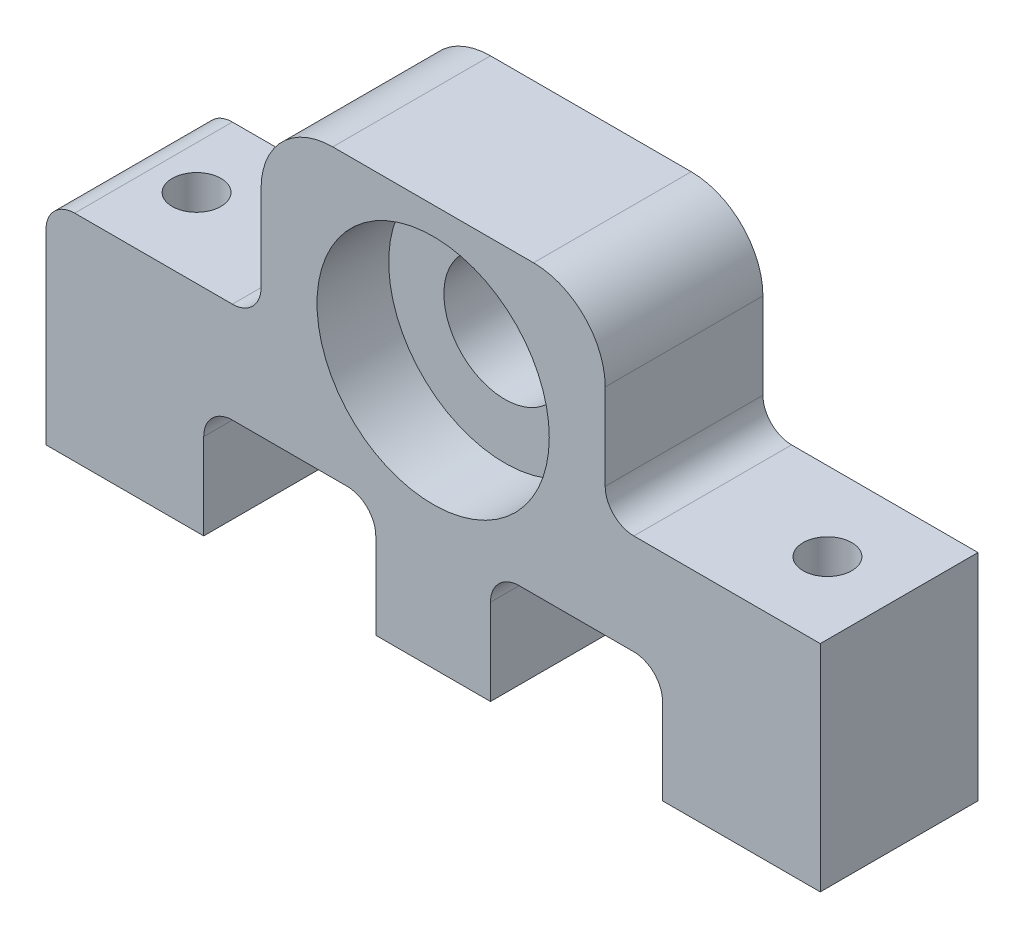
ISO-10303-21;
HEADER;
FILE_DESCRIPTION(('STEP AP214'),'2;1');
FILE_NAME('part.step','',(''),(''),'','','');
FILE_SCHEMA(('AUTOMOTIVE_DESIGN { 1 0 10303 214 1 1 1 1 }'));
ENDSEC;
DATA;
#1=APPLICATION_CONTEXT('core data for automotive mechanical design processes');
#2=APPLICATION_PROTOCOL_DEFINITION('international standard','automotive_design',2000,#1);
#3=PRODUCT_CONTEXT('',#1,'mechanical');
#4=PRODUCT('Part','Part','',(#3));
#5=PRODUCT_RELATED_PRODUCT_CATEGORY('part','',(#4));
#6=PRODUCT_DEFINITION_FORMATION('','',#4);
#7=PRODUCT_DEFINITION_CONTEXT('part definition',#1,'design');
#8=PRODUCT_DEFINITION('design','',#6,#7);
#9=PRODUCT_DEFINITION_SHAPE('','',#8);
#10=(LENGTH_UNIT() NAMED_UNIT(*) SI_UNIT(.MILLI.,.METRE.));
#11=(NAMED_UNIT(*) PLANE_ANGLE_UNIT() SI_UNIT($,.RADIAN.));
#12=(NAMED_UNIT(*) SI_UNIT($,.STERADIAN.) SOLID_ANGLE_UNIT());
#13=UNCERTAINTY_MEASURE_WITH_UNIT(LENGTH_MEASURE(1.E-05),#10,'distance_accuracy_value','');
#14=(GEOMETRIC_REPRESENTATION_CONTEXT(3) GLOBAL_UNCERTAINTY_ASSIGNED_CONTEXT((#13)) GLOBAL_UNIT_ASSIGNED_CONTEXT((#10,
#11,#12)) REPRESENTATION_CONTEXT('',''));
#15=CARTESIAN_POINT('',(0.,0.,0.));
#16=DIRECTION('',(0.,0.,1.));
#17=DIRECTION('',(1.,0.,0.));
#18=AXIS2_PLACEMENT_3D('',#15,#16,#17);
#19=CARTESIAN_POINT('',(-12.,-14.,11.));
#20=DIRECTION('',(0.,1.,0.));
#21=DIRECTION('',(0.,0.,1.));
#22=AXIS2_PLACEMENT_3D('',#19,#20,#21);
#23=PLANE('',#22);
#24=CARTESIAN_POINT('',(-22.,-14.,5.49999999999999));
#25=DIRECTION('',(0.,1.,0.));
#26=DIRECTION('',(-1.,0.,0.));
#27=AXIS2_PLACEMENT_3D('',#24,#25,#26);
#28=CIRCLE('',#27,1.7);
#29=CARTESIAN_POINT('',(-23.7,-14.,5.49999999999999));
#30=VERTEX_POINT('',#29);
#31=EDGE_CURVE('E306',#30,#30,#28,.T.);
#32=ORIENTED_EDGE('',*,*,#31,.T.);
#33=EDGE_LOOP('',(#32));
#34=FACE_BOUND('',#33,.T.);
#35=DIRECTION('',(1.,0.,0.));
#36=VECTOR('',#35,1.);
#37=CARTESIAN_POINT('',(-12.,-14.,0.));
#38=LINE('',#37,#36);
#39=CARTESIAN_POINT('',(-27.,-14.,0.));
#40=VERTEX_POINT('',#39);
#41=CARTESIAN_POINT('',(-16.,-14.,0.));
#42=VERTEX_POINT('',#41);
#43=EDGE_CURVE('E212',#40,#42,#38,.T.);
#44=ORIENTED_EDGE('',*,*,#43,.T.);
#45=DIRECTION('',(0.,0.,1.));
#46=VECTOR('',#45,1.);
#47=CARTESIAN_POINT('',(-16.,-14.,0.));
#48=LINE('',#47,#46);
#49=CARTESIAN_POINT('',(-16.,-14.,11.));
#50=VERTEX_POINT('',#49);
#51=EDGE_CURVE('E224',#42,#50,#48,.T.);
#52=ORIENTED_EDGE('',*,*,#51,.T.);
#53=DIRECTION('',(1.,0.,0.));
#54=VECTOR('',#53,1.);
#55=CARTESIAN_POINT('',(-12.,-14.,11.));
#56=LINE('',#55,#54);
#57=CARTESIAN_POINT('',(-27.,-14.,11.));
#58=VERTEX_POINT('',#57);
#59=EDGE_CURVE('E263',#58,#50,#56,.T.);
#60=ORIENTED_EDGE('',*,*,#59,.F.);
#61=DIRECTION('',(0.,0.,1.));
#62=VECTOR('',#61,1.);
#63=CARTESIAN_POINT('',(-27.,-14.,-21.2132034355964));
#64=LINE('',#63,#62);
#65=EDGE_CURVE('E236',#40,#58,#64,.T.);
#66=ORIENTED_EDGE('',*,*,#65,.F.);
#67=EDGE_LOOP('',(#44,#52,#60,#66));
#68=FACE_BOUND('',#67,.T.);
#69=ADVANCED_FACE('F36',(#34,#68),#23,.F.);
#70=CARTESIAN_POINT('',(22.,-14.,5.5));
#71=DIRECTION('',(0.,1.,0.));
#72=DIRECTION('',(-1.,0.,0.));
#73=AXIS2_PLACEMENT_3D('',#70,#71,#72);
#74=CIRCLE('',#73,1.7);
#75=CARTESIAN_POINT('',(20.3,-14.,5.5));
#76=VERTEX_POINT('',#75);
#77=EDGE_CURVE('E309',#76,#76,#74,.T.);
#78=ORIENTED_EDGE('',*,*,#77,.T.);
#79=EDGE_LOOP('',(#78));
#80=FACE_BOUND('',#79,.T.);
#81=CARTESIAN_POINT('',(16.,-14.,11.));
#82=VERTEX_POINT('',#81);
#83=CARTESIAN_POINT('',(27.,-14.,11.));
#84=VERTEX_POINT('',#83);
#85=EDGE_CURVE('E267',#82,#84,#56,.T.);
#86=ORIENTED_EDGE('',*,*,#85,.F.);
#87=DIRECTION('',(0.,0.,1.));
#88=VECTOR('',#87,1.);
#89=CARTESIAN_POINT('',(16.,-14.,0.));
#90=LINE('',#89,#88);
#91=CARTESIAN_POINT('',(16.,-14.,0.));
#92=VERTEX_POINT('',#91);
#93=EDGE_CURVE('E316',#92,#82,#90,.T.);
#94=ORIENTED_EDGE('',*,*,#93,.F.);
#95=CARTESIAN_POINT('',(27.,-14.,0.));
#96=VERTEX_POINT('',#95);
#97=EDGE_CURVE('E240',#92,#96,#38,.T.);
#98=ORIENTED_EDGE('',*,*,#97,.T.);
#99=DIRECTION('',(0.,0.,1.));
#100=VECTOR('',#99,1.);
#101=CARTESIAN_POINT('',(27.,-14.,-21.2132034355964));
#102=LINE('',#101,#100);
#103=EDGE_CURVE('E292',#96,#84,#102,.T.);
#104=ORIENTED_EDGE('',*,*,#103,.T.);
#105=EDGE_LOOP('',(#86,#94,#98,#104));
#106=FACE_BOUND('',#105,.T.);
#107=ADVANCED_FACE('F493',(#80,#106),#23,.F.);
#108=CARTESIAN_POINT('',(12.,14.,11.));
#109=DIRECTION('',(-1.,0.,0.));
#110=DIRECTION('',(0.,0.,1.));
#111=AXIS2_PLACEMENT_3D('',#108,#109,#110);
#112=PLANE('',#111);
#113=DIRECTION('',(0.,1.,0.));
#114=VECTOR('',#113,1.);
#115=CARTESIAN_POINT('',(12.,14.,0.));
#116=LINE('',#115,#114);
#117=CARTESIAN_POINT('',(12.,3.,0.));
#118=VERTEX_POINT('',#117);
#119=CARTESIAN_POINT('',(12.,9.,0.));
#120=VERTEX_POINT('',#119);
#121=EDGE_CURVE('E258',#118,#120,#116,.T.);
#122=ORIENTED_EDGE('',*,*,#121,.T.);
#123=DIRECTION('',(0.,0.,-1.));
#124=VECTOR('',#123,1.);
#125=CARTESIAN_POINT('',(12.,9.,2.34999999999999));
#126=LINE('',#125,#124);
#127=CARTESIAN_POINT('',(12.,9.,11.));
#128=VERTEX_POINT('',#127);
#129=EDGE_CURVE('E59',#120,#128,#126,.F.);
#130=ORIENTED_EDGE('',*,*,#129,.T.);
#131=DIRECTION('',(0.,1.,0.));
#132=VECTOR('',#131,1.);
#133=CARTESIAN_POINT('',(12.,14.,11.));
#134=LINE('',#133,#132);
#135=CARTESIAN_POINT('',(12.,3.,11.));
#136=VERTEX_POINT('',#135);
#137=EDGE_CURVE('E237',#136,#128,#134,.T.);
#138=ORIENTED_EDGE('',*,*,#137,.F.);
#139=DIRECTION('',(0.,0.,1.));
#140=VECTOR('',#139,1.);
#141=CARTESIAN_POINT('',(12.,3.,8.65));
#142=LINE('',#141,#140);
#143=EDGE_CURVE('E379',#136,#118,#142,.F.);
#144=ORIENTED_EDGE('',*,*,#143,.T.);
#145=EDGE_LOOP('',(#122,#130,#138,#144));
#146=FACE_BOUND('',#145,.T.);
#147=ADVANCED_FACE('F413',(#146),#112,.F.);
#148=CARTESIAN_POINT('',(0.,4.,11.));
#149=DIRECTION('',(0.,0.,-1.));
#150=DIRECTION('',(-1.,0.,0.));
#151=AXIS2_PLACEMENT_3D('',#148,#149,#150);
#152=CYLINDRICAL_SURFACE('',#151,4.25);
#153=CARTESIAN_POINT('',(0.,4.,0.));
#154=DIRECTION('',(0.,0.,1.));
#155=DIRECTION('',(1.,0.,0.));
#156=AXIS2_PLACEMENT_3D('',#153,#154,#155);
#157=CIRCLE('',#156,4.25);
#158=CARTESIAN_POINT('',(4.25,4.,0.));
#159=VERTEX_POINT('',#158);
#160=EDGE_CURVE('E262',#159,#159,#157,.T.);
#161=ORIENTED_EDGE('',*,*,#160,.F.);
#162=EDGE_LOOP('',(#161));
#163=FACE_BOUND('',#162,.T.);
#164=CARTESIAN_POINT('',(0.,4.,6.));
#165=DIRECTION('',(0.,0.,1.));
#166=DIRECTION('',(1.,0.,0.));
#167=AXIS2_PLACEMENT_3D('',#164,#165,#166);
#168=CIRCLE('',#167,4.25);
#169=CARTESIAN_POINT('',(4.25,4.,6.));
#170=VERTEX_POINT('',#169);
#171=EDGE_CURVE('E273',#170,#170,#168,.T.);
#172=ORIENTED_EDGE('',*,*,#171,.T.);
#173=EDGE_LOOP('',(#172));
#174=FACE_BOUND('',#173,.T.);
#175=ADVANCED_FACE('F551',(#163,#174),#152,.F.);
#176=CARTESIAN_POINT('',(0.,0.,11.));
#177=DIRECTION('',(0.,0.,1.));
#178=DIRECTION('',(1.,0.,0.));
#179=AXIS2_PLACEMENT_3D('',#176,#177,#178);
#180=PLANE('',#179);
#181=ORIENTED_EDGE('',*,*,#137,.T.);
#182=CARTESIAN_POINT('',(7.,9.,11.));
#183=DIRECTION('',(0.,0.,1.));
#184=DIRECTION('',(1.,0.,0.));
#185=AXIS2_PLACEMENT_3D('',#182,#183,#184);
#186=CIRCLE('',#185,5.);
#187=CARTESIAN_POINT('',(7.,14.,11.));
#188=VERTEX_POINT('',#187);
#189=EDGE_CURVE('E44',#128,#188,#186,.T.);
#190=ORIENTED_EDGE('',*,*,#189,.T.);
#191=DIRECTION('',(-1.,0.,0.));
#192=VECTOR('',#191,1.);
#193=CARTESIAN_POINT('',(-12.,14.,11.));
#194=LINE('',#193,#192);
#195=CARTESIAN_POINT('',(-7.00000000000001,14.,11.));
#196=VERTEX_POINT('',#195);
#197=EDGE_CURVE('E241',#188,#196,#194,.T.);
#198=ORIENTED_EDGE('',*,*,#197,.T.);
#199=CARTESIAN_POINT('',(-7.00000000000001,9.,11.));
#200=DIRECTION('',(0.,0.,1.));
#201=DIRECTION('',(1.,0.,0.));
#202=AXIS2_PLACEMENT_3D('',#199,#200,#201);
#203=CIRCLE('',#202,5.);
#204=CARTESIAN_POINT('',(-12.,9.,11.));
#205=VERTEX_POINT('',#204);
#206=EDGE_CURVE('E51',#196,#205,#203,.T.);
#207=ORIENTED_EDGE('',*,*,#206,.T.);
#208=DIRECTION('',(0.,-1.,0.));
#209=VECTOR('',#208,1.);
#210=CARTESIAN_POINT('',(-12.,14.,11.));
#211=LINE('',#210,#209);
#212=CARTESIAN_POINT('',(-12.,3.00000000000001,11.));
#213=VERTEX_POINT('',#212);
#214=EDGE_CURVE('E268',#205,#213,#211,.T.);
#215=ORIENTED_EDGE('',*,*,#214,.T.);
#216=CARTESIAN_POINT('',(-14.,3.,11.));
#217=DIRECTION('',(0.,0.,1.));
#218=DIRECTION('',(1.,0.,0.));
#219=AXIS2_PLACEMENT_3D('',#216,#217,#218);
#220=CIRCLE('',#219,2.);
#221=CARTESIAN_POINT('',(-14.,1.,11.));
#222=VERTEX_POINT('',#221);
#223=EDGE_CURVE('E387',#213,#222,#220,.F.);
#224=ORIENTED_EDGE('',*,*,#223,.T.);
#225=DIRECTION('',(-1.,0.,0.));
#226=VECTOR('',#225,1.);
#227=CARTESIAN_POINT('',(-12.,1.,11.));
#228=LINE('',#227,#226);
#229=CARTESIAN_POINT('',(-25.,1.,11.));
#230=VERTEX_POINT('',#229);
#231=EDGE_CURVE('E287',#222,#230,#228,.T.);
#232=ORIENTED_EDGE('',*,*,#231,.T.);
#233=CARTESIAN_POINT('',(-25.,-0.999999999999997,11.));
#234=DIRECTION('',(0.,0.,1.));
#235=DIRECTION('',(1.,0.,0.));
#236=AXIS2_PLACEMENT_3D('',#233,#234,#235);
#237=CIRCLE('',#236,2.);
#238=CARTESIAN_POINT('',(-27.,-0.999999999999997,11.));
#239=VERTEX_POINT('',#238);
#240=EDGE_CURVE('E370',#230,#239,#237,.T.);
#241=ORIENTED_EDGE('',*,*,#240,.T.);
#242=DIRECTION('',(0.,-1.,0.));
#243=VECTOR('',#242,1.);
#244=CARTESIAN_POINT('',(-27.,1.,11.));
#245=LINE('',#244,#243);
#246=EDGE_CURVE('E285',#239,#58,#245,.T.);
#247=ORIENTED_EDGE('',*,*,#246,.T.);
#248=ORIENTED_EDGE('',*,*,#59,.T.);
#249=DIRECTION('',(0.,-1.,0.));
#250=VECTOR('',#249,1.);
#251=CARTESIAN_POINT('',(-16.,-14.,11.));
#252=LINE('',#251,#250);
#253=CARTESIAN_POINT('',(-16.,-8.,11.));
#254=VERTEX_POINT('',#253);
#255=EDGE_CURVE('E227',#254,#50,#252,.T.);
#256=ORIENTED_EDGE('',*,*,#255,.F.);
#257=CARTESIAN_POINT('',(-14.,-8.,11.));
#258=DIRECTION('',(0.,0.,1.));
#259=DIRECTION('',(1.,0.,0.));
#260=AXIS2_PLACEMENT_3D('',#257,#258,#259);
#261=CIRCLE('',#260,2.);
#262=CARTESIAN_POINT('',(-14.,-6.,11.));
#263=VERTEX_POINT('',#262);
#264=EDGE_CURVE('E356',#254,#263,#261,.F.);
#265=ORIENTED_EDGE('',*,*,#264,.T.);
#266=DIRECTION('',(-1.,0.,0.));
#267=VECTOR('',#266,1.);
#268=CARTESIAN_POINT('',(-16.,-6.,11.));
#269=LINE('',#268,#267);
#270=CARTESIAN_POINT('',(-6.,-6.,11.));
#271=VERTEX_POINT('',#270);
#272=EDGE_CURVE('E221',#271,#263,#269,.T.);
#273=ORIENTED_EDGE('',*,*,#272,.F.);
#274=CARTESIAN_POINT('',(-6.,-8.,11.));
#275=DIRECTION('',(0.,0.,1.));
#276=DIRECTION('',(1.,0.,0.));
#277=AXIS2_PLACEMENT_3D('',#274,#275,#276);
#278=CIRCLE('',#277,2.);
#279=CARTESIAN_POINT('',(-4.,-8.,11.));
#280=VERTEX_POINT('',#279);
#281=EDGE_CURVE('E357',#271,#280,#278,.F.);
#282=ORIENTED_EDGE('',*,*,#281,.T.);
#283=DIRECTION('',(0.,1.,0.));
#284=VECTOR('',#283,1.);
#285=CARTESIAN_POINT('',(-3.99999999999999,-14.,11.));
#286=LINE('',#285,#284);
#287=CARTESIAN_POINT('',(-3.99999999999999,-14.,11.));
#288=VERTEX_POINT('',#287);
#289=EDGE_CURVE('E337',#288,#280,#286,.T.);
#290=ORIENTED_EDGE('',*,*,#289,.F.);
#291=CARTESIAN_POINT('',(4.,-14.,11.));
#292=VERTEX_POINT('',#291);
#293=EDGE_CURVE('E266',#288,#292,#56,.T.);
#294=ORIENTED_EDGE('',*,*,#293,.T.);
#295=DIRECTION('',(0.,-1.,0.));
#296=VECTOR('',#295,1.);
#297=CARTESIAN_POINT('',(4.,-14.,11.));
#298=LINE('',#297,#296);
#299=CARTESIAN_POINT('',(4.,-8.,11.));
#300=VERTEX_POINT('',#299);
#301=EDGE_CURVE('E319',#300,#292,#298,.T.);
#302=ORIENTED_EDGE('',*,*,#301,.F.);
#303=CARTESIAN_POINT('',(6.,-8.,11.));
#304=DIRECTION('',(0.,0.,1.));
#305=DIRECTION('',(1.,0.,0.));
#306=AXIS2_PLACEMENT_3D('',#303,#304,#305);
#307=CIRCLE('',#306,2.);
#308=CARTESIAN_POINT('',(6.,-6.,11.));
#309=VERTEX_POINT('',#308);
#310=EDGE_CURVE('E439',#300,#309,#307,.F.);
#311=ORIENTED_EDGE('',*,*,#310,.T.);
#312=DIRECTION('',(-1.,0.,0.));
#313=VECTOR('',#312,1.);
#314=CARTESIAN_POINT('',(16.,-6.,11.));
#315=LINE('',#314,#313);
#316=CARTESIAN_POINT('',(14.,-6.,11.));
#317=VERTEX_POINT('',#316);
#318=EDGE_CURVE('E322',#317,#309,#315,.T.);
#319=ORIENTED_EDGE('',*,*,#318,.F.);
#320=CARTESIAN_POINT('',(14.,-8.,11.));
#321=DIRECTION('',(0.,0.,1.));
#322=DIRECTION('',(1.,0.,0.));
#323=AXIS2_PLACEMENT_3D('',#320,#321,#322);
#324=CIRCLE('',#323,2.);
#325=CARTESIAN_POINT('',(16.,-8.,11.));
#326=VERTEX_POINT('',#325);
#327=EDGE_CURVE('E440',#317,#326,#324,.F.);
#328=ORIENTED_EDGE('',*,*,#327,.T.);
#329=DIRECTION('',(0.,1.,0.));
#330=VECTOR('',#329,1.);
#331=CARTESIAN_POINT('',(16.,-14.,11.));
#332=LINE('',#331,#330);
#333=EDGE_CURVE('E325',#82,#326,#332,.T.);
#334=ORIENTED_EDGE('',*,*,#333,.F.);
#335=ORIENTED_EDGE('',*,*,#85,.T.);
#336=DIRECTION('',(0.,1.,0.));
#337=VECTOR('',#336,1.);
#338=CARTESIAN_POINT('',(27.,-14.,11.));
#339=LINE('',#338,#337);
#340=CARTESIAN_POINT('',(27.,1.,11.));
#341=VERTEX_POINT('',#340);
#342=EDGE_CURVE('E295',#84,#341,#339,.T.);
#343=ORIENTED_EDGE('',*,*,#342,.T.);
#344=DIRECTION('',(-1.,0.,0.));
#345=VECTOR('',#344,1.);
#346=CARTESIAN_POINT('',(27.,1.,11.));
#347=LINE('',#346,#345);
#348=CARTESIAN_POINT('',(14.,0.999999999999999,11.));
#349=VERTEX_POINT('',#348);
#350=EDGE_CURVE('E300',#341,#349,#347,.T.);
#351=ORIENTED_EDGE('',*,*,#350,.T.);
#352=CARTESIAN_POINT('',(14.,3.,11.));
#353=DIRECTION('',(0.,0.,1.));
#354=DIRECTION('',(1.,0.,0.));
#355=AXIS2_PLACEMENT_3D('',#352,#353,#354);
#356=CIRCLE('',#355,2.);
#357=EDGE_CURVE('E383',#349,#136,#356,.F.);
#358=ORIENTED_EDGE('',*,*,#357,.T.);
#359=EDGE_LOOP('',(#181,#190,#198,#207,#215,#224,#232,#241,#247,#248,#256,#265,#273,#282,#290,
#294,#302,#311,#319,#328,#334,#335,#343,#351,#358));
#360=FACE_BOUND('',#359,.T.);
#361=CARTESIAN_POINT('',(0.,4.,11.));
#362=DIRECTION('',(0.,0.,1.));
#363=DIRECTION('',(1.,0.,0.));
#364=AXIS2_PLACEMENT_3D('',#361,#362,#363);
#365=CIRCLE('',#364,8.1);
#366=CARTESIAN_POINT('',(8.1,4.,11.));
#367=VERTEX_POINT('',#366);
#368=EDGE_CURVE('E274',#367,#367,#365,.T.);
#369=ORIENTED_EDGE('',*,*,#368,.F.);
#370=EDGE_LOOP('',(#369));
#371=FACE_BOUND('',#370,.T.);
#372=ADVANCED_FACE('F403',(#360,#371),#180,.T.);
#373=CARTESIAN_POINT('',(0.,0.,0.));
#374=DIRECTION('',(0.,0.,1.));
#375=DIRECTION('',(1.,0.,0.));
#376=AXIS2_PLACEMENT_3D('',#373,#374,#375);
#377=PLANE('',#376);
#378=DIRECTION('',(-1.,0.,0.));
#379=VECTOR('',#378,1.);
#380=CARTESIAN_POINT('',(-12.,14.,0.));
#381=LINE('',#380,#379);
#382=CARTESIAN_POINT('',(7.,14.,0.));
#383=VERTEX_POINT('',#382);
#384=CARTESIAN_POINT('',(-7.00000000000001,14.,0.));
#385=VERTEX_POINT('',#384);
#386=EDGE_CURVE('E252',#383,#385,#381,.T.);
#387=ORIENTED_EDGE('',*,*,#386,.F.);
#388=CARTESIAN_POINT('',(7.,9.,0.));
#389=DIRECTION('',(0.,0.,1.));
#390=DIRECTION('',(1.,0.,0.));
#391=AXIS2_PLACEMENT_3D('',#388,#389,#390);
#392=CIRCLE('',#391,5.);
#393=EDGE_CURVE('E398',#383,#120,#392,.F.);
#394=ORIENTED_EDGE('',*,*,#393,.T.);
#395=ORIENTED_EDGE('',*,*,#121,.F.);
#396=CARTESIAN_POINT('',(14.,3.,0.));
#397=DIRECTION('',(0.,0.,1.));
#398=DIRECTION('',(1.,0.,0.));
#399=AXIS2_PLACEMENT_3D('',#396,#397,#398);
#400=CIRCLE('',#399,2.);
#401=CARTESIAN_POINT('',(14.,0.999999999999999,0.));
#402=VERTEX_POINT('',#401);
#403=EDGE_CURVE('E385',#118,#402,#400,.T.);
#404=ORIENTED_EDGE('',*,*,#403,.T.);
#405=DIRECTION('',(1.,0.,0.));
#406=VECTOR('',#405,1.);
#407=CARTESIAN_POINT('',(27.,1.,0.));
#408=LINE('',#407,#406);
#409=CARTESIAN_POINT('',(27.,1.,0.));
#410=VERTEX_POINT('',#409);
#411=EDGE_CURVE('E290',#402,#410,#408,.T.);
#412=ORIENTED_EDGE('',*,*,#411,.T.);
#413=DIRECTION('',(0.,-1.,0.));
#414=VECTOR('',#413,1.);
#415=CARTESIAN_POINT('',(27.,-14.,0.));
#416=LINE('',#415,#414);
#417=EDGE_CURVE('E297',#410,#96,#416,.T.);
#418=ORIENTED_EDGE('',*,*,#417,.T.);
#419=ORIENTED_EDGE('',*,*,#97,.F.);
#420=DIRECTION('',(0.,1.,0.));
#421=VECTOR('',#420,1.);
#422=CARTESIAN_POINT('',(16.,-14.,0.));
#423=LINE('',#422,#421);
#424=CARTESIAN_POINT('',(16.,-8.,0.));
#425=VERTEX_POINT('',#424);
#426=EDGE_CURVE('E321',#92,#425,#423,.T.);
#427=ORIENTED_EDGE('',*,*,#426,.T.);
#428=CARTESIAN_POINT('',(14.,-8.,0.));
#429=DIRECTION('',(0.,0.,1.));
#430=DIRECTION('',(1.,0.,0.));
#431=AXIS2_PLACEMENT_3D('',#428,#429,#430);
#432=CIRCLE('',#431,2.);
#433=CARTESIAN_POINT('',(14.,-6.,0.));
#434=VERTEX_POINT('',#433);
#435=EDGE_CURVE('E429',#425,#434,#432,.T.);
#436=ORIENTED_EDGE('',*,*,#435,.T.);
#437=DIRECTION('',(-1.,0.,0.));
#438=VECTOR('',#437,1.);
#439=CARTESIAN_POINT('',(16.,-6.,0.));
#440=LINE('',#439,#438);
#441=CARTESIAN_POINT('',(6.,-6.,0.));
#442=VERTEX_POINT('',#441);
#443=EDGE_CURVE('E329',#434,#442,#440,.T.);
#444=ORIENTED_EDGE('',*,*,#443,.T.);
#445=CARTESIAN_POINT('',(6.,-8.,0.));
#446=DIRECTION('',(0.,0.,1.));
#447=DIRECTION('',(1.,0.,0.));
#448=AXIS2_PLACEMENT_3D('',#445,#446,#447);
#449=CIRCLE('',#448,2.);
#450=CARTESIAN_POINT('',(4.,-8.,0.));
#451=VERTEX_POINT('',#450);
#452=EDGE_CURVE('E360',#442,#451,#449,.T.);
#453=ORIENTED_EDGE('',*,*,#452,.T.);
#454=DIRECTION('',(0.,-1.,0.));
#455=VECTOR('',#454,1.);
#456=CARTESIAN_POINT('',(4.,-14.,0.));
#457=LINE('',#456,#455);
#458=CARTESIAN_POINT('',(4.,-14.,0.));
#459=VERTEX_POINT('',#458);
#460=EDGE_CURVE('E317',#451,#459,#457,.T.);
#461=ORIENTED_EDGE('',*,*,#460,.T.);
#462=CARTESIAN_POINT('',(-3.99999999999999,-14.,0.));
#463=VERTEX_POINT('',#462);
#464=EDGE_CURVE('E238',#463,#459,#38,.T.);
#465=ORIENTED_EDGE('',*,*,#464,.F.);
#466=DIRECTION('',(0.,1.,0.));
#467=VECTOR('',#466,1.);
#468=CARTESIAN_POINT('',(-3.99999999999999,-14.,0.));
#469=LINE('',#468,#467);
#470=CARTESIAN_POINT('',(-4.,-8.,0.));
#471=VERTEX_POINT('',#470);
#472=EDGE_CURVE('E220',#463,#471,#469,.T.);
#473=ORIENTED_EDGE('',*,*,#472,.T.);
#474=CARTESIAN_POINT('',(-6.,-8.,0.));
#475=DIRECTION('',(0.,0.,1.));
#476=DIRECTION('',(1.,0.,0.));
#477=AXIS2_PLACEMENT_3D('',#474,#475,#476);
#478=CIRCLE('',#477,2.);
#479=CARTESIAN_POINT('',(-6.,-6.,0.));
#480=VERTEX_POINT('',#479);
#481=EDGE_CURVE('E345',#471,#480,#478,.T.);
#482=ORIENTED_EDGE('',*,*,#481,.T.);
#483=DIRECTION('',(-1.,0.,0.));
#484=VECTOR('',#483,1.);
#485=CARTESIAN_POINT('',(-16.,-6.,0.));
#486=LINE('',#485,#484);
#487=CARTESIAN_POINT('',(-14.,-6.,0.));
#488=VERTEX_POINT('',#487);
#489=EDGE_CURVE('E232',#480,#488,#486,.T.);
#490=ORIENTED_EDGE('',*,*,#489,.T.);
#491=CARTESIAN_POINT('',(-14.,-8.,0.));
#492=DIRECTION('',(0.,0.,1.));
#493=DIRECTION('',(1.,0.,0.));
#494=AXIS2_PLACEMENT_3D('',#491,#492,#493);
#495=CIRCLE('',#494,2.);
#496=CARTESIAN_POINT('',(-16.,-8.,0.));
#497=VERTEX_POINT('',#496);
#498=EDGE_CURVE('E216',#488,#497,#495,.T.);
#499=ORIENTED_EDGE('',*,*,#498,.T.);
#500=DIRECTION('',(0.,-1.,0.));
#501=VECTOR('',#500,1.);
#502=CARTESIAN_POINT('',(-16.,-14.,0.));
#503=LINE('',#502,#501);
#504=EDGE_CURVE('E205',#497,#42,#503,.T.);
#505=ORIENTED_EDGE('',*,*,#504,.T.);
#506=ORIENTED_EDGE('',*,*,#43,.F.);
#507=DIRECTION('',(0.,1.,0.));
#508=VECTOR('',#507,1.);
#509=CARTESIAN_POINT('',(-27.,1.,0.));
#510=LINE('',#509,#508);
#511=CARTESIAN_POINT('',(-27.,-0.999999999999997,0.));
#512=VERTEX_POINT('',#511);
#513=EDGE_CURVE('E283',#40,#512,#510,.T.);
#514=ORIENTED_EDGE('',*,*,#513,.T.);
#515=CARTESIAN_POINT('',(-25.,-0.999999999999997,0.));
#516=DIRECTION('',(0.,0.,1.));
#517=DIRECTION('',(1.,0.,0.));
#518=AXIS2_PLACEMENT_3D('',#515,#516,#517);
#519=CIRCLE('',#518,2.);
#520=CARTESIAN_POINT('',(-25.,1.,0.));
#521=VERTEX_POINT('',#520);
#522=EDGE_CURVE('E374',#512,#521,#519,.F.);
#523=ORIENTED_EDGE('',*,*,#522,.T.);
#524=DIRECTION('',(1.,0.,0.));
#525=VECTOR('',#524,1.);
#526=CARTESIAN_POINT('',(-12.,1.,0.));
#527=LINE('',#526,#525);
#528=CARTESIAN_POINT('',(-14.,1.,0.));
#529=VERTEX_POINT('',#528);
#530=EDGE_CURVE('E278',#521,#529,#527,.T.);
#531=ORIENTED_EDGE('',*,*,#530,.T.);
#532=CARTESIAN_POINT('',(-14.,3.,0.));
#533=DIRECTION('',(0.,0.,1.));
#534=DIRECTION('',(1.,0.,0.));
#535=AXIS2_PLACEMENT_3D('',#532,#533,#534);
#536=CIRCLE('',#535,2.);
#537=CARTESIAN_POINT('',(-12.,3.00000000000001,0.));
#538=VERTEX_POINT('',#537);
#539=EDGE_CURVE('E389',#529,#538,#536,.T.);
#540=ORIENTED_EDGE('',*,*,#539,.T.);
#541=DIRECTION('',(0.,-1.,0.));
#542=VECTOR('',#541,1.);
#543=CARTESIAN_POINT('',(-12.,14.,0.));
#544=LINE('',#543,#542);
#545=CARTESIAN_POINT('',(-12.,9.,0.));
#546=VERTEX_POINT('',#545);
#547=EDGE_CURVE('E246',#546,#538,#544,.T.);
#548=ORIENTED_EDGE('',*,*,#547,.F.);
#549=CARTESIAN_POINT('',(-7.00000000000001,9.,0.));
#550=DIRECTION('',(0.,0.,1.));
#551=DIRECTION('',(1.,0.,0.));
#552=AXIS2_PLACEMENT_3D('',#549,#550,#551);
#553=CIRCLE('',#552,5.);
#554=EDGE_CURVE('E396',#546,#385,#553,.F.);
#555=ORIENTED_EDGE('',*,*,#554,.T.);
#556=EDGE_LOOP('',(#387,#394,#395,#404,#412,#418,#419,#427,#436,#444,#453,#461,#465,#473,#482,
#490,#499,#505,#506,#514,#523,#531,#540,#548,#555));
#557=FACE_BOUND('',#556,.T.);
#558=ORIENTED_EDGE('',*,*,#160,.T.);
#559=EDGE_LOOP('',(#558));
#560=FACE_BOUND('',#559,.T.);
#561=ADVANCED_FACE('F208',(#557,#560),#377,.F.);
#562=CARTESIAN_POINT('',(-12.,14.,11.));
#563=DIRECTION('',(0.,-1.,0.));
#564=DIRECTION('',(0.,0.,-1.));
#565=AXIS2_PLACEMENT_3D('',#562,#563,#564);
#566=PLANE('',#565);
#567=ORIENTED_EDGE('',*,*,#197,.F.);
#568=DIRECTION('',(0.,0.,-1.));
#569=VECTOR('',#568,1.);
#570=CARTESIAN_POINT('',(7.,14.,11.));
#571=LINE('',#570,#569);
#572=EDGE_CURVE('E393',#188,#383,#571,.T.);
#573=ORIENTED_EDGE('',*,*,#572,.T.);
#574=ORIENTED_EDGE('',*,*,#386,.T.);
#575=DIRECTION('',(0.,0.,-1.));
#576=VECTOR('',#575,1.);
#577=CARTESIAN_POINT('',(-7.00000000000001,14.,11.));
#578=LINE('',#577,#576);
#579=EDGE_CURVE('E391',#385,#196,#578,.F.);
#580=ORIENTED_EDGE('',*,*,#579,.T.);
#581=EDGE_LOOP('',(#567,#573,#574,#580));
#582=FACE_BOUND('',#581,.T.);
#583=ADVANCED_FACE('F408',(#582),#566,.F.);
#584=CARTESIAN_POINT('',(-12.,14.,11.));
#585=DIRECTION('',(1.,0.,0.));
#586=DIRECTION('',(0.,0.,-1.));
#587=AXIS2_PLACEMENT_3D('',#584,#585,#586);
#588=PLANE('',#587);
#589=ORIENTED_EDGE('',*,*,#214,.F.);
#590=DIRECTION('',(0.,0.,-1.));
#591=VECTOR('',#590,1.);
#592=CARTESIAN_POINT('',(-12.,9.,11.));
#593=LINE('',#592,#591);
#594=EDGE_CURVE('E11',#205,#546,#593,.T.);
#595=ORIENTED_EDGE('',*,*,#594,.T.);
#596=ORIENTED_EDGE('',*,*,#547,.T.);
#597=DIRECTION('',(0.,0.,1.));
#598=VECTOR('',#597,1.);
#599=CARTESIAN_POINT('',(-12.,3.,11.));
#600=LINE('',#599,#598);
#601=EDGE_CURVE('E381',#538,#213,#600,.T.);
#602=ORIENTED_EDGE('',*,*,#601,.T.);
#603=EDGE_LOOP('',(#589,#595,#596,#602));
#604=FACE_BOUND('',#603,.T.);
#605=ADVANCED_FACE('F485',(#604),#588,.F.);
#606=ORIENTED_EDGE('',*,*,#293,.F.);
#607=DIRECTION('',(0.,0.,1.));
#608=VECTOR('',#607,1.);
#609=CARTESIAN_POINT('',(-3.99999999999999,-14.,0.));
#610=LINE('',#609,#608);
#611=EDGE_CURVE('E231',#463,#288,#610,.T.);
#612=ORIENTED_EDGE('',*,*,#611,.F.);
#613=ORIENTED_EDGE('',*,*,#464,.T.);
#614=DIRECTION('',(0.,0.,1.));
#615=VECTOR('',#614,1.);
#616=CARTESIAN_POINT('',(4.,-14.,0.));
#617=LINE('',#616,#615);
#618=EDGE_CURVE('E313',#459,#292,#617,.T.);
#619=ORIENTED_EDGE('',*,*,#618,.T.);
#620=EDGE_LOOP('',(#606,#612,#613,#619));
#621=FACE_BOUND('',#620,.T.);
#622=ADVANCED_FACE('F496',(#621),#23,.F.);
#623=CARTESIAN_POINT('',(0.,4.,6.));
#624=DIRECTION('',(0.,0.,1.));
#625=DIRECTION('',(1.,0.,0.));
#626=AXIS2_PLACEMENT_3D('',#623,#624,#625);
#627=CYLINDRICAL_SURFACE('',#626,8.1);
#628=CARTESIAN_POINT('',(0.,4.,6.));
#629=DIRECTION('',(0.,0.,1.));
#630=DIRECTION('',(1.,0.,0.));
#631=AXIS2_PLACEMENT_3D('',#628,#629,#630);
#632=CIRCLE('',#631,8.1);
#633=CARTESIAN_POINT('',(8.1,4.,6.));
#634=VERTEX_POINT('',#633);
#635=EDGE_CURVE('E277',#634,#634,#632,.T.);
#636=ORIENTED_EDGE('',*,*,#635,.F.);
#637=EDGE_LOOP('',(#636));
#638=FACE_BOUND('',#637,.T.);
#639=ORIENTED_EDGE('',*,*,#368,.T.);
#640=EDGE_LOOP('',(#639));
#641=FACE_BOUND('',#640,.T.);
#642=ADVANCED_FACE('F504',(#638,#641),#627,.F.);
#643=CARTESIAN_POINT('',(0.,4.,6.));
#644=DIRECTION('',(0.,0.,1.));
#645=DIRECTION('',(1.,0.,0.));
#646=AXIS2_PLACEMENT_3D('',#643,#644,#645);
#647=PLANE('',#646);
#648=ORIENTED_EDGE('',*,*,#171,.F.);
#649=EDGE_LOOP('',(#648));
#650=FACE_BOUND('',#649,.T.);
#651=ORIENTED_EDGE('',*,*,#635,.T.);
#652=EDGE_LOOP('',(#651));
#653=FACE_BOUND('',#652,.T.);
#654=ADVANCED_FACE('F510',(#650,#653),#647,.T.);
#655=CARTESIAN_POINT('',(-27.,1.,-21.2132034355964));
#656=DIRECTION('',(-1.,0.,0.));
#657=DIRECTION('',(0.,0.,1.));
#658=AXIS2_PLACEMENT_3D('',#655,#656,#657);
#659=PLANE('',#658);
#660=ORIENTED_EDGE('',*,*,#246,.F.);
#661=DIRECTION('',(0.,0.,1.));
#662=VECTOR('',#661,1.);
#663=CARTESIAN_POINT('',(-27.,-0.999999999999997,-21.2132034355964));
#664=LINE('',#663,#662);
#665=EDGE_CURVE('E372',#239,#512,#664,.F.);
#666=ORIENTED_EDGE('',*,*,#665,.T.);
#667=ORIENTED_EDGE('',*,*,#513,.F.);
#668=ORIENTED_EDGE('',*,*,#65,.T.);
#669=EDGE_LOOP('',(#660,#666,#667,#668));
#670=FACE_BOUND('',#669,.T.);
#671=ADVANCED_FACE('F469',(#670),#659,.T.);
#672=CARTESIAN_POINT('',(-12.,1.,-21.2132034355964));
#673=DIRECTION('',(0.,1.,0.));
#674=DIRECTION('',(-1.,0.,0.));
#675=AXIS2_PLACEMENT_3D('',#672,#673,#674);
#676=PLANE('',#675);
#677=CARTESIAN_POINT('',(-22.,1.,5.49999999999999));
#678=DIRECTION('',(0.,1.,0.));
#679=DIRECTION('',(-1.,0.,0.));
#680=AXIS2_PLACEMENT_3D('',#677,#678,#679);
#681=CIRCLE('',#680,1.7);
#682=CARTESIAN_POINT('',(-23.7,1.,5.49999999999999));
#683=VERTEX_POINT('',#682);
#684=EDGE_CURVE('E303',#683,#683,#681,.T.);
#685=ORIENTED_EDGE('',*,*,#684,.F.);
#686=EDGE_LOOP('',(#685));
#687=FACE_BOUND('',#686,.T.);
#688=ORIENTED_EDGE('',*,*,#530,.F.);
#689=DIRECTION('',(0.,0.,1.));
#690=VECTOR('',#689,1.);
#691=CARTESIAN_POINT('',(-25.,1.,-21.2132034355964));
#692=LINE('',#691,#690);
#693=EDGE_CURVE('E367',#521,#230,#692,.T.);
#694=ORIENTED_EDGE('',*,*,#693,.T.);
#695=ORIENTED_EDGE('',*,*,#231,.F.);
#696=DIRECTION('',(0.,0.,1.));
#697=VECTOR('',#696,1.);
#698=CARTESIAN_POINT('',(-14.,1.,-21.2132034355964));
#699=LINE('',#698,#697);
#700=EDGE_CURVE('E365',#222,#529,#699,.F.);
#701=ORIENTED_EDGE('',*,*,#700,.T.);
#702=EDGE_LOOP('',(#688,#694,#695,#701));
#703=FACE_BOUND('',#702,.T.);
#704=ADVANCED_FACE('F478',(#687,#703),#676,.T.);
#705=CARTESIAN_POINT('',(27.,1.,-21.2132034355964));
#706=DIRECTION('',(0.,1.,0.));
#707=DIRECTION('',(-1.,0.,0.));
#708=AXIS2_PLACEMENT_3D('',#705,#706,#707);
#709=PLANE('',#708);
#710=CARTESIAN_POINT('',(22.,1.,5.5));
#711=DIRECTION('',(0.,1.,0.));
#712=DIRECTION('',(-1.,0.,0.));
#713=AXIS2_PLACEMENT_3D('',#710,#711,#712);
#714=CIRCLE('',#713,1.7);
#715=CARTESIAN_POINT('',(20.3,0.999999999999999,5.5));
#716=VERTEX_POINT('',#715);
#717=EDGE_CURVE('E312',#716,#716,#714,.T.);
#718=ORIENTED_EDGE('',*,*,#717,.F.);
#719=EDGE_LOOP('',(#718));
#720=FACE_BOUND('',#719,.T.);
#721=ORIENTED_EDGE('',*,*,#411,.F.);
#722=DIRECTION('',(0.,0.,1.));
#723=VECTOR('',#722,1.);
#724=CARTESIAN_POINT('',(14.,0.999999999999999,-21.2132034355964));
#725=LINE('',#724,#723);
#726=EDGE_CURVE('E376',#402,#349,#725,.T.);
#727=ORIENTED_EDGE('',*,*,#726,.T.);
#728=ORIENTED_EDGE('',*,*,#350,.F.);
#729=DIRECTION('',(0.,0.,1.));
#730=VECTOR('',#729,1.);
#731=CARTESIAN_POINT('',(27.,1.,-21.2132034355964));
#732=LINE('',#731,#730);
#733=EDGE_CURVE('E294',#410,#341,#732,.T.);
#734=ORIENTED_EDGE('',*,*,#733,.F.);
#735=EDGE_LOOP('',(#721,#727,#728,#734));
#736=FACE_BOUND('',#735,.T.);
#737=ADVANCED_FACE('F422',(#720,#736),#709,.T.);
#738=CARTESIAN_POINT('',(27.,-14.,-21.2132034355964));
#739=DIRECTION('',(1.,0.,0.));
#740=DIRECTION('',(0.,0.,-1.));
#741=AXIS2_PLACEMENT_3D('',#738,#739,#740);
#742=PLANE('',#741);
#743=ORIENTED_EDGE('',*,*,#417,.F.);
#744=ORIENTED_EDGE('',*,*,#733,.T.);
#745=ORIENTED_EDGE('',*,*,#342,.F.);
#746=ORIENTED_EDGE('',*,*,#103,.F.);
#747=EDGE_LOOP('',(#743,#744,#745,#746));
#748=FACE_BOUND('',#747,.T.);
#749=ADVANCED_FACE('F426',(#748),#742,.T.);
#750=CARTESIAN_POINT('',(22.,-14.,5.5));
#751=DIRECTION('',(0.,1.,0.));
#752=DIRECTION('',(-1.,0.,0.));
#753=AXIS2_PLACEMENT_3D('',#750,#751,#752);
#754=CYLINDRICAL_SURFACE('',#753,1.7);
#755=CARTESIAN_POINT('',(20.3,0.999999999999999,5.5));
#756=CARTESIAN_POINT('',(20.3,0.843749999999999,5.5));
#757=CARTESIAN_POINT('',(20.3,0.687499999999999,5.5));
#758=CARTESIAN_POINT('',(20.3,0.374999999999999,5.5));
#759=CARTESIAN_POINT('',(20.3,0.218749999999998,5.5));
#760=CARTESIAN_POINT('',(20.3,-0.0937500000000013,5.5));
#761=CARTESIAN_POINT('',(20.3,-0.250000000000001,5.5));
#762=CARTESIAN_POINT('',(20.3,-0.5625,5.5));
#763=CARTESIAN_POINT('',(20.3,-0.718750000000001,5.5));
#764=CARTESIAN_POINT('',(20.3,-1.03125,5.5));
#765=CARTESIAN_POINT('',(20.3,-1.1875,5.5));
#766=CARTESIAN_POINT('',(20.3,-1.5,5.5));
#767=CARTESIAN_POINT('',(20.3,-1.65625,5.5));
#768=CARTESIAN_POINT('',(20.3,-1.96875,5.5));
#769=CARTESIAN_POINT('',(20.3,-2.125,5.5));
#770=CARTESIAN_POINT('',(20.3,-2.4375,5.5));
#771=CARTESIAN_POINT('',(20.3,-2.59375,5.5));
#772=CARTESIAN_POINT('',(20.3,-2.90625,5.5));
#773=CARTESIAN_POINT('',(20.3,-3.0625,5.5));
#774=CARTESIAN_POINT('',(20.3,-3.375,5.5));
#775=CARTESIAN_POINT('',(20.3,-3.53125,5.5));
#776=CARTESIAN_POINT('',(20.3,-3.84375,5.5));
#777=CARTESIAN_POINT('',(20.3,-4.,5.5));
#778=CARTESIAN_POINT('',(20.3,-4.3125,5.5));
#779=CARTESIAN_POINT('',(20.3,-4.46875,5.5));
#780=CARTESIAN_POINT('',(20.3,-4.78125,5.5));
#781=CARTESIAN_POINT('',(20.3,-4.9375,5.5));
#782=CARTESIAN_POINT('',(20.3,-5.25,5.5));
#783=CARTESIAN_POINT('',(20.3,-5.40625,5.5));
#784=CARTESIAN_POINT('',(20.3,-5.71875,5.5));
#785=CARTESIAN_POINT('',(20.3,-5.875,5.5));
#786=CARTESIAN_POINT('',(20.3,-6.1875,5.5));
#787=CARTESIAN_POINT('',(20.3,-6.34375,5.5));
#788=CARTESIAN_POINT('',(20.3,-6.65625,5.5));
#789=CARTESIAN_POINT('',(20.3,-6.8125,5.5));
#790=CARTESIAN_POINT('',(20.3,-7.125,5.5));
#791=CARTESIAN_POINT('',(20.3,-7.28125,5.5));
#792=CARTESIAN_POINT('',(20.3,-7.59375,5.5));
#793=CARTESIAN_POINT('',(20.3,-7.75,5.5));
#794=CARTESIAN_POINT('',(20.3,-8.0625,5.5));
#795=CARTESIAN_POINT('',(20.3,-8.21875,5.5));
#796=CARTESIAN_POINT('',(20.3,-8.53125,5.5));
#797=CARTESIAN_POINT('',(20.3,-8.6875,5.5));
#798=CARTESIAN_POINT('',(20.3,-9.,5.5));
#799=CARTESIAN_POINT('',(20.3,-9.15625,5.5));
#800=CARTESIAN_POINT('',(20.3,-9.46875,5.5));
#801=CARTESIAN_POINT('',(20.3,-9.625,5.5));
#802=CARTESIAN_POINT('',(20.3,-9.9375,5.5));
#803=CARTESIAN_POINT('',(20.3,-10.09375,5.5));
#804=CARTESIAN_POINT('',(20.3,-10.40625,5.5));
#805=CARTESIAN_POINT('',(20.3,-10.5625,5.5));
#806=CARTESIAN_POINT('',(20.3,-10.875,5.5));
#807=CARTESIAN_POINT('',(20.3,-11.03125,5.5));
#808=CARTESIAN_POINT('',(20.3,-11.34375,5.5));
#809=CARTESIAN_POINT('',(20.3,-11.5,5.5));
#810=CARTESIAN_POINT('',(20.3,-11.8125,5.5));
#811=CARTESIAN_POINT('',(20.3,-11.96875,5.5));
#812=CARTESIAN_POINT('',(20.3,-12.28125,5.5));
#813=CARTESIAN_POINT('',(20.3,-12.4375,5.5));
#814=CARTESIAN_POINT('',(20.3,-12.75,5.5));
#815=CARTESIAN_POINT('',(20.3,-12.90625,5.5));
#816=CARTESIAN_POINT('',(20.3,-13.21875,5.5));
#817=CARTESIAN_POINT('',(20.3,-13.375,5.5));
#818=CARTESIAN_POINT('',(20.3,-13.6875,5.5));
#819=CARTESIAN_POINT('',(20.3,-13.84375,5.5));
#820=CARTESIAN_POINT('',(20.3,-14.,5.5));
#821=B_SPLINE_CURVE_WITH_KNOTS('',3,(#755,#756,#757,#758,#759,#760,#761,#762,#763,#764,#765,
#766,#767,#768,#769,#770,#771,#772,#773,#774,#775,#776,#777,#778,#779,#780,#781,#782,#783,#784,
#785,#786,#787,#788,#789,#790,#791,#792,#793,#794,#795,#796,#797,#798,#799,#800,#801,#802,#803,
#804,#805,#806,#807,#808,#809,#810,#811,#812,#813,#814,#815,#816,#817,#818,#819,#820),
.UNSPECIFIED.,.F.,.F.,(4,2,2,2,2,2,2,2,2,2,2,2,2,2,2,2,2,2,2,2,2,2,2,2,2,2,2,2,2,2,2,2,4),(0.,
0.46875,0.937500000000001,1.40625,1.875,2.34375,2.8125,3.28125,3.75,4.21875,4.6875,5.15625,
5.625,6.09375,6.5625,7.03125,7.5,7.96875,8.4375,8.90625,9.375,9.84375,10.3125,10.78125,11.25,
11.71875,12.1875,12.65625,13.125,13.59375,14.0625,14.53125,15.),.UNSPECIFIED.);
#822=EDGE_CURVE('BSEAM531',#716,#76,#821,.T.);
#823=ORIENTED_EDGE('',*,*,#717,.T.);
#824=ORIENTED_EDGE('',*,*,#77,.F.);
#825=ORIENTED_EDGE('',*,*,#822,.T.);
#826=ORIENTED_EDGE('',*,*,#822,.F.);
#827=EDGE_LOOP('',(#823,#825,#824,#826));
#828=FACE_BOUND('',#827,.T.);
#829=ADVANCED_FACE('F531',(#828),#754,.F.);
#830=CARTESIAN_POINT('',(-22.,-14.,5.49999999999999));
#831=DIRECTION('',(0.,1.,0.));
#832=DIRECTION('',(-1.,0.,0.));
#833=AXIS2_PLACEMENT_3D('',#830,#831,#832);
#834=CYLINDRICAL_SURFACE('',#833,1.7);
#835=CARTESIAN_POINT('',(-23.7,1.,5.49999999999999));
#836=CARTESIAN_POINT('',(-23.7,0.843750000000002,5.49999999999999));
#837=CARTESIAN_POINT('',(-23.7,0.687500000000002,5.49999999999999));
#838=CARTESIAN_POINT('',(-23.7,0.375000000000002,5.49999999999999));
#839=CARTESIAN_POINT('',(-23.7,0.218750000000002,5.49999999999999));
#840=CARTESIAN_POINT('',(-23.7,-0.0937499999999983,5.49999999999999));
#841=CARTESIAN_POINT('',(-23.7,-0.249999999999999,5.49999999999999));
#842=CARTESIAN_POINT('',(-23.7,-0.562499999999999,5.49999999999999));
#843=CARTESIAN_POINT('',(-23.7,-0.718749999999999,5.49999999999999));
#844=CARTESIAN_POINT('',(-23.7,-1.03125,5.49999999999999));
#845=CARTESIAN_POINT('',(-23.7,-1.1875,5.49999999999999));
#846=CARTESIAN_POINT('',(-23.7,-1.5,5.49999999999999));
#847=CARTESIAN_POINT('',(-23.7,-1.65625,5.49999999999999));
#848=CARTESIAN_POINT('',(-23.7,-1.96875,5.49999999999999));
#849=CARTESIAN_POINT('',(-23.7,-2.125,5.49999999999999));
#850=CARTESIAN_POINT('',(-23.7,-2.4375,5.49999999999999));
#851=CARTESIAN_POINT('',(-23.7,-2.59375,5.49999999999999));
#852=CARTESIAN_POINT('',(-23.7,-2.90625,5.49999999999999));
#853=CARTESIAN_POINT('',(-23.7,-3.0625,5.49999999999999));
#854=CARTESIAN_POINT('',(-23.7,-3.375,5.49999999999999));
#855=CARTESIAN_POINT('',(-23.7,-3.53125,5.49999999999999));
#856=CARTESIAN_POINT('',(-23.7,-3.84375,5.49999999999999));
#857=CARTESIAN_POINT('',(-23.7,-4.,5.49999999999999));
#858=CARTESIAN_POINT('',(-23.7,-4.3125,5.49999999999999));
#859=CARTESIAN_POINT('',(-23.7,-4.46875,5.49999999999999));
#860=CARTESIAN_POINT('',(-23.7,-4.78125,5.49999999999999));
#861=CARTESIAN_POINT('',(-23.7,-4.9375,5.49999999999999));
#862=CARTESIAN_POINT('',(-23.7,-5.25,5.49999999999999));
#863=CARTESIAN_POINT('',(-23.7,-5.40625,5.49999999999999));
#864=CARTESIAN_POINT('',(-23.7,-5.71875,5.49999999999999));
#865=CARTESIAN_POINT('',(-23.7,-5.875,5.49999999999999));
#866=CARTESIAN_POINT('',(-23.7,-6.1875,5.49999999999999));
#867=CARTESIAN_POINT('',(-23.7,-6.34375,5.49999999999999));
#868=CARTESIAN_POINT('',(-23.7,-6.65625,5.49999999999999));
#869=CARTESIAN_POINT('',(-23.7,-6.8125,5.49999999999999));
#870=CARTESIAN_POINT('',(-23.7,-7.125,5.49999999999999));
#871=CARTESIAN_POINT('',(-23.7,-7.28125,5.49999999999999));
#872=CARTESIAN_POINT('',(-23.7,-7.59375,5.49999999999999));
#873=CARTESIAN_POINT('',(-23.7,-7.75,5.49999999999999));
#874=CARTESIAN_POINT('',(-23.7,-8.0625,5.49999999999999));
#875=CARTESIAN_POINT('',(-23.7,-8.21875,5.49999999999999));
#876=CARTESIAN_POINT('',(-23.7,-8.53125,5.49999999999999));
#877=CARTESIAN_POINT('',(-23.7,-8.6875,5.49999999999999));
#878=CARTESIAN_POINT('',(-23.7,-9.,5.49999999999999));
#879=CARTESIAN_POINT('',(-23.7,-9.15625,5.49999999999999));
#880=CARTESIAN_POINT('',(-23.7,-9.46875,5.49999999999999));
#881=CARTESIAN_POINT('',(-23.7,-9.625,5.49999999999999));
#882=CARTESIAN_POINT('',(-23.7,-9.9375,5.49999999999999));
#883=CARTESIAN_POINT('',(-23.7,-10.09375,5.49999999999999));
#884=CARTESIAN_POINT('',(-23.7,-10.40625,5.49999999999999));
#885=CARTESIAN_POINT('',(-23.7,-10.5625,5.49999999999999));
#886=CARTESIAN_POINT('',(-23.7,-10.875,5.49999999999999));
#887=CARTESIAN_POINT('',(-23.7,-11.03125,5.49999999999999));
#888=CARTESIAN_POINT('',(-23.7,-11.34375,5.49999999999999));
#889=CARTESIAN_POINT('',(-23.7,-11.5,5.49999999999999));
#890=CARTESIAN_POINT('',(-23.7,-11.8125,5.49999999999999));
#891=CARTESIAN_POINT('',(-23.7,-11.96875,5.49999999999999));
#892=CARTESIAN_POINT('',(-23.7,-12.28125,5.49999999999999));
#893=CARTESIAN_POINT('',(-23.7,-12.4375,5.49999999999999));
#894=CARTESIAN_POINT('',(-23.7,-12.75,5.49999999999999));
#895=CARTESIAN_POINT('',(-23.7,-12.90625,5.49999999999999));
#896=CARTESIAN_POINT('',(-23.7,-13.21875,5.49999999999999));
#897=CARTESIAN_POINT('',(-23.7,-13.375,5.49999999999999));
#898=CARTESIAN_POINT('',(-23.7,-13.6875,5.49999999999999));
#899=CARTESIAN_POINT('',(-23.7,-13.84375,5.49999999999999));
#900=CARTESIAN_POINT('',(-23.7,-14.,5.49999999999999));
#901=B_SPLINE_CURVE_WITH_KNOTS('',3,(#835,#836,#837,#838,#839,#840,#841,#842,#843,#844,#845,
#846,#847,#848,#849,#850,#851,#852,#853,#854,#855,#856,#857,#858,#859,#860,#861,#862,#863,#864,
#865,#866,#867,#868,#869,#870,#871,#872,#873,#874,#875,#876,#877,#878,#879,#880,#881,#882,#883,
#884,#885,#886,#887,#888,#889,#890,#891,#892,#893,#894,#895,#896,#897,#898,#899,#900),
.UNSPECIFIED.,.F.,.F.,(4,2,2,2,2,2,2,2,2,2,2,2,2,2,2,2,2,2,2,2,2,2,2,2,2,2,2,2,2,2,2,2,4),(0.,
0.46875,0.937500000000001,1.40625,1.875,2.34375,2.8125,3.28125,3.75,4.21875,4.6875,5.15625,
5.625,6.09375,6.5625,7.03125,7.5,7.96875,8.4375,8.90625,9.37500000000001,9.84375000000001,
10.3125,10.78125,11.25,11.71875,12.1875,12.65625,13.125,13.59375,14.0625,14.53125,15.),.UNSPECIFIED.);
#902=EDGE_CURVE('BSEAM527',#683,#30,#901,.T.);
#903=ORIENTED_EDGE('',*,*,#684,.T.);
#904=ORIENTED_EDGE('',*,*,#31,.F.);
#905=ORIENTED_EDGE('',*,*,#902,.T.);
#906=ORIENTED_EDGE('',*,*,#902,.F.);
#907=EDGE_LOOP('',(#903,#905,#904,#906));
#908=FACE_BOUND('',#907,.T.);
#909=ADVANCED_FACE('F527',(#908),#834,.F.);
#910=CARTESIAN_POINT('',(16.,-6.,0.));
#911=DIRECTION('',(0.,1.,0.));
#912=DIRECTION('',(-1.,0.,0.));
#913=AXIS2_PLACEMENT_3D('',#910,#911,#912);
#914=PLANE('',#913);
#915=ORIENTED_EDGE('',*,*,#443,.F.);
#916=DIRECTION('',(0.,0.,1.));
#917=VECTOR('',#916,1.);
#918=CARTESIAN_POINT('',(14.,-6.,11.));
#919=LINE('',#918,#917);
#920=EDGE_CURVE('E438',#434,#317,#919,.T.);
#921=ORIENTED_EDGE('',*,*,#920,.T.);
#922=ORIENTED_EDGE('',*,*,#318,.T.);
#923=DIRECTION('',(0.,0.,1.));
#924=VECTOR('',#923,1.);
#925=CARTESIAN_POINT('',(6.,-6.,0.));
#926=LINE('',#925,#924);
#927=EDGE_CURVE('E265',#309,#442,#926,.F.);
#928=ORIENTED_EDGE('',*,*,#927,.T.);
#929=EDGE_LOOP('',(#915,#921,#922,#928));
#930=FACE_BOUND('',#929,.T.);
#931=ADVANCED_FACE('F520',(#930),#914,.F.);
#932=CARTESIAN_POINT('',(16.,-14.,0.));
#933=DIRECTION('',(1.,0.,0.));
#934=DIRECTION('',(0.,0.,-1.));
#935=AXIS2_PLACEMENT_3D('',#932,#933,#934);
#936=PLANE('',#935);
#937=ORIENTED_EDGE('',*,*,#333,.T.);
#938=DIRECTION('',(0.,0.,1.));
#939=VECTOR('',#938,1.);
#940=CARTESIAN_POINT('',(16.,-8.,0.));
#941=LINE('',#940,#939);
#942=EDGE_CURVE('E436',#326,#425,#941,.F.);
#943=ORIENTED_EDGE('',*,*,#942,.T.);
#944=ORIENTED_EDGE('',*,*,#426,.F.);
#945=ORIENTED_EDGE('',*,*,#93,.T.);
#946=EDGE_LOOP('',(#937,#943,#944,#945));
#947=FACE_BOUND('',#946,.T.);
#948=ADVANCED_FACE('F518',(#947),#936,.F.);
#949=CARTESIAN_POINT('',(4.,-14.,0.));
#950=DIRECTION('',(-1.,0.,0.));
#951=DIRECTION('',(0.,-1.,0.));
#952=AXIS2_PLACEMENT_3D('',#949,#950,#951);
#953=PLANE('',#952);
#954=ORIENTED_EDGE('',*,*,#460,.F.);
#955=DIRECTION('',(0.,0.,1.));
#956=VECTOR('',#955,1.);
#957=CARTESIAN_POINT('',(4.,-8.,11.));
#958=LINE('',#957,#956);
#959=EDGE_CURVE('E455',#451,#300,#958,.T.);
#960=ORIENTED_EDGE('',*,*,#959,.T.);
#961=ORIENTED_EDGE('',*,*,#301,.T.);
#962=ORIENTED_EDGE('',*,*,#618,.F.);
#963=EDGE_LOOP('',(#954,#960,#961,#962));
#964=FACE_BOUND('',#963,.T.);
#965=ADVANCED_FACE('F454',(#964),#953,.F.);
#966=CARTESIAN_POINT('',(-16.,-14.,0.));
#967=DIRECTION('',(-1.,0.,0.));
#968=DIRECTION('',(0.,0.,1.));
#969=AXIS2_PLACEMENT_3D('',#966,#967,#968);
#970=PLANE('',#969);
#971=ORIENTED_EDGE('',*,*,#504,.F.);
#972=DIRECTION('',(0.,0.,1.));
#973=VECTOR('',#972,1.);
#974=CARTESIAN_POINT('',(-16.,-8.,11.));
#975=LINE('',#974,#973);
#976=EDGE_CURVE('E443',#497,#254,#975,.T.);
#977=ORIENTED_EDGE('',*,*,#976,.T.);
#978=ORIENTED_EDGE('',*,*,#255,.T.);
#979=ORIENTED_EDGE('',*,*,#51,.F.);
#980=EDGE_LOOP('',(#971,#977,#978,#979));
#981=FACE_BOUND('',#980,.T.);
#982=ADVANCED_FACE('F225',(#981),#970,.F.);
#983=CARTESIAN_POINT('',(-16.,-6.,0.));
#984=DIRECTION('',(0.,1.,0.));
#985=DIRECTION('',(-1.,0.,0.));
#986=AXIS2_PLACEMENT_3D('',#983,#984,#985);
#987=PLANE('',#986);
#988=ORIENTED_EDGE('',*,*,#489,.F.);
#989=DIRECTION('',(0.,0.,1.));
#990=VECTOR('',#989,1.);
#991=CARTESIAN_POINT('',(-6.,-6.,11.));
#992=LINE('',#991,#990);
#993=EDGE_CURVE('E355',#480,#271,#992,.T.);
#994=ORIENTED_EDGE('',*,*,#993,.T.);
#995=ORIENTED_EDGE('',*,*,#272,.T.);
#996=DIRECTION('',(0.,0.,1.));
#997=VECTOR('',#996,1.);
#998=CARTESIAN_POINT('',(-14.,-6.,0.));
#999=LINE('',#998,#997);
#1000=EDGE_CURVE('E458',#263,#488,#999,.F.);
#1001=ORIENTED_EDGE('',*,*,#1000,.T.);
#1002=EDGE_LOOP('',(#988,#994,#995,#1001));
#1003=FACE_BOUND('',#1002,.T.);
#1004=ADVANCED_FACE('F714',(#1003),#987,.F.);
#1005=CARTESIAN_POINT('',(-3.99999999999999,-14.,0.));
#1006=DIRECTION('',(1.,0.,0.));
#1007=DIRECTION('',(0.,1.,0.));
#1008=AXIS2_PLACEMENT_3D('',#1005,#1006,#1007);
#1009=PLANE('',#1008);
#1010=ORIENTED_EDGE('',*,*,#289,.T.);
#1011=DIRECTION('',(0.,0.,1.));
#1012=VECTOR('',#1011,1.);
#1013=CARTESIAN_POINT('',(-4.,-8.,0.));
#1014=LINE('',#1013,#1012);
#1015=EDGE_CURVE('E353',#280,#471,#1014,.F.);
#1016=ORIENTED_EDGE('',*,*,#1015,.T.);
#1017=ORIENTED_EDGE('',*,*,#472,.F.);
#1018=ORIENTED_EDGE('',*,*,#611,.T.);
#1019=EDGE_LOOP('',(#1010,#1016,#1017,#1018));
#1020=FACE_BOUND('',#1019,.T.);
#1021=ADVANCED_FACE('F568',(#1020),#1009,.F.);
#1022=CARTESIAN_POINT('',(14.,-8.,0.));
#1023=DIRECTION('',(0.,0.,-1.));
#1024=DIRECTION('',(-1.,0.,0.));
#1025=AXIS2_PLACEMENT_3D('',#1022,#1023,#1024);
#1026=CYLINDRICAL_SURFACE('',#1025,2.);
#1027=ORIENTED_EDGE('',*,*,#435,.F.);
#1028=ORIENTED_EDGE('',*,*,#942,.F.);
#1029=ORIENTED_EDGE('',*,*,#327,.F.);
#1030=ORIENTED_EDGE('',*,*,#920,.F.);
#1031=EDGE_LOOP('',(#1027,#1028,#1029,#1030));
#1032=FACE_BOUND('',#1031,.T.);
#1033=ADVANCED_FACE('F435',(#1032),#1026,.F.);
#1034=CARTESIAN_POINT('',(6.,-8.,0.));
#1035=DIRECTION('',(0.,0.,-1.));
#1036=DIRECTION('',(-1.,0.,0.));
#1037=AXIS2_PLACEMENT_3D('',#1034,#1035,#1036);
#1038=CYLINDRICAL_SURFACE('',#1037,2.);
#1039=ORIENTED_EDGE('',*,*,#452,.F.);
#1040=ORIENTED_EDGE('',*,*,#927,.F.);
#1041=ORIENTED_EDGE('',*,*,#310,.F.);
#1042=ORIENTED_EDGE('',*,*,#959,.F.);
#1043=EDGE_LOOP('',(#1039,#1040,#1041,#1042));
#1044=FACE_BOUND('',#1043,.T.);
#1045=ADVANCED_FACE('F457',(#1044),#1038,.F.);
#1046=CARTESIAN_POINT('',(-6.,-8.,0.));
#1047=DIRECTION('',(0.,0.,-1.));
#1048=DIRECTION('',(-1.,0.,0.));
#1049=AXIS2_PLACEMENT_3D('',#1046,#1047,#1048);
#1050=CYLINDRICAL_SURFACE('',#1049,2.);
#1051=ORIENTED_EDGE('',*,*,#481,.F.);
#1052=ORIENTED_EDGE('',*,*,#1015,.F.);
#1053=ORIENTED_EDGE('',*,*,#281,.F.);
#1054=ORIENTED_EDGE('',*,*,#993,.F.);
#1055=EDGE_LOOP('',(#1051,#1052,#1053,#1054));
#1056=FACE_BOUND('',#1055,.T.);
#1057=ADVANCED_FACE('F352',(#1056),#1050,.F.);
#1058=CARTESIAN_POINT('',(-14.,-8.,0.));
#1059=DIRECTION('',(0.,0.,-1.));
#1060=DIRECTION('',(-1.,0.,0.));
#1061=AXIS2_PLACEMENT_3D('',#1058,#1059,#1060);
#1062=CYLINDRICAL_SURFACE('',#1061,2.);
#1063=ORIENTED_EDGE('',*,*,#498,.F.);
#1064=ORIENTED_EDGE('',*,*,#1000,.F.);
#1065=ORIENTED_EDGE('',*,*,#264,.F.);
#1066=ORIENTED_EDGE('',*,*,#976,.F.);
#1067=EDGE_LOOP('',(#1063,#1064,#1065,#1066));
#1068=FACE_BOUND('',#1067,.T.);
#1069=ADVANCED_FACE('F573',(#1068),#1062,.F.);
#1070=CARTESIAN_POINT('',(-25.,-0.999999999999997,-21.2132034355964));
#1071=DIRECTION('',(0.,0.,1.));
#1072=DIRECTION('',(1.,0.,0.));
#1073=AXIS2_PLACEMENT_3D('',#1070,#1071,#1072);
#1074=CYLINDRICAL_SURFACE('',#1073,2.);
#1075=ORIENTED_EDGE('',*,*,#522,.F.);
#1076=ORIENTED_EDGE('',*,*,#665,.F.);
#1077=ORIENTED_EDGE('',*,*,#240,.F.);
#1078=ORIENTED_EDGE('',*,*,#693,.F.);
#1079=EDGE_LOOP('',(#1075,#1076,#1077,#1078));
#1080=FACE_BOUND('',#1079,.T.);
#1081=ADVANCED_FACE('F475',(#1080),#1074,.T.);
#1082=CARTESIAN_POINT('',(14.,3.,-21.2132034355964));
#1083=DIRECTION('',(0.,0.,1.));
#1084=DIRECTION('',(1.,0.,0.));
#1085=AXIS2_PLACEMENT_3D('',#1082,#1083,#1084);
#1086=CYLINDRICAL_SURFACE('',#1085,2.);
#1087=ORIENTED_EDGE('',*,*,#403,.F.);
#1088=ORIENTED_EDGE('',*,*,#143,.F.);
#1089=ORIENTED_EDGE('',*,*,#357,.F.);
#1090=ORIENTED_EDGE('',*,*,#726,.F.);
#1091=EDGE_LOOP('',(#1087,#1088,#1089,#1090));
#1092=FACE_BOUND('',#1091,.T.);
#1093=ADVANCED_FACE('F416',(#1092),#1086,.F.);
#1094=CARTESIAN_POINT('',(-14.,3.,11.));
#1095=DIRECTION('',(0.,0.,1.));
#1096=DIRECTION('',(1.,0.,0.));
#1097=AXIS2_PLACEMENT_3D('',#1094,#1095,#1096);
#1098=CYLINDRICAL_SURFACE('',#1097,2.);
#1099=ORIENTED_EDGE('',*,*,#539,.F.);
#1100=ORIENTED_EDGE('',*,*,#700,.F.);
#1101=ORIENTED_EDGE('',*,*,#223,.F.);
#1102=ORIENTED_EDGE('',*,*,#601,.F.);
#1103=EDGE_LOOP('',(#1099,#1100,#1101,#1102));
#1104=FACE_BOUND('',#1103,.T.);
#1105=ADVANCED_FACE('F484',(#1104),#1098,.F.);
#1106=CARTESIAN_POINT('',(7.,9.,11.));
#1107=DIRECTION('',(0.,0.,-1.));
#1108=DIRECTION('',(-1.,0.,0.));
#1109=AXIS2_PLACEMENT_3D('',#1106,#1107,#1108);
#1110=CYLINDRICAL_SURFACE('',#1109,5.);
#1111=ORIENTED_EDGE('',*,*,#189,.F.);
#1112=ORIENTED_EDGE('',*,*,#129,.F.);
#1113=ORIENTED_EDGE('',*,*,#393,.F.);
#1114=ORIENTED_EDGE('',*,*,#572,.F.);
#1115=EDGE_LOOP('',(#1111,#1112,#1113,#1114));
#1116=FACE_BOUND('',#1115,.T.);
#1117=ADVANCED_FACE('F410',(#1116),#1110,.T.);
#1118=CARTESIAN_POINT('',(-7.00000000000001,9.,11.));
#1119=DIRECTION('',(0.,0.,-1.));
#1120=DIRECTION('',(-1.,0.,0.));
#1121=AXIS2_PLACEMENT_3D('',#1118,#1119,#1120);
#1122=CYLINDRICAL_SURFACE('',#1121,5.);
#1123=ORIENTED_EDGE('',*,*,#206,.F.);
#1124=ORIENTED_EDGE('',*,*,#579,.F.);
#1125=ORIENTED_EDGE('',*,*,#554,.F.);
#1126=ORIENTED_EDGE('',*,*,#594,.F.);
#1127=EDGE_LOOP('',(#1123,#1124,#1125,#1126));
#1128=FACE_BOUND('',#1127,.T.);
#1129=ADVANCED_FACE('F38',(#1128),#1122,.T.);
#1130=CLOSED_SHELL('',(#69,#107,#147,#175,#372,#561,#583,#605,#622,#642,#654,#671,#704,#737,
#749,#829,#909,#931,#948,#965,#982,#1004,#1021,#1033,#1045,#1057,#1069,#1081,#1093,#1105,#1117,#1129));
#1131=MANIFOLD_SOLID_BREP('B2',#1130);
#1132=ADVANCED_BREP_SHAPE_REPRESENTATION('',(#18,#1131),#14);
#1133=SHAPE_DEFINITION_REPRESENTATION(#9,#1132);
ENDSEC;
END-ISO-10303-21;
